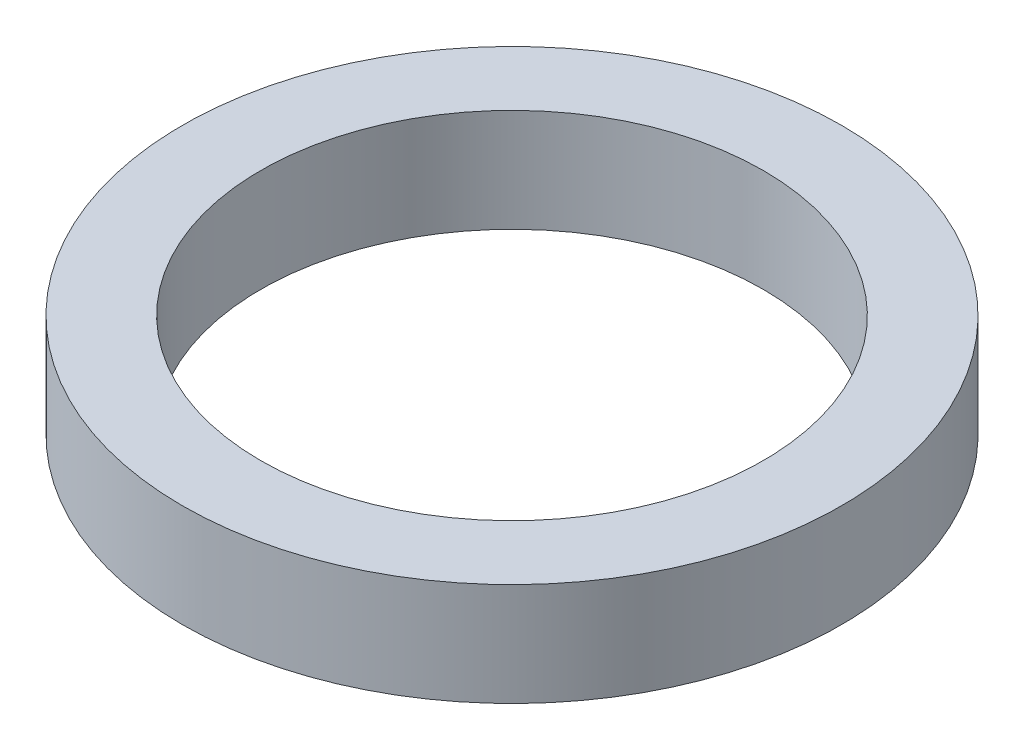
ISO-10303-21;
HEADER;
FILE_DESCRIPTION(('STEP AP214'),'2;1');
FILE_NAME('part.step','',(''),(''),'','','');
FILE_SCHEMA(('AUTOMOTIVE_DESIGN { 1 0 10303 214 1 1 1 1 }'));
ENDSEC;
DATA;
#1=APPLICATION_CONTEXT('core data for automotive mechanical design processes');
#2=APPLICATION_PROTOCOL_DEFINITION('international standard','automotive_design',2000,#1);
#3=PRODUCT_CONTEXT('',#1,'mechanical');
#4=PRODUCT('Part','Part','',(#3));
#5=PRODUCT_RELATED_PRODUCT_CATEGORY('part','',(#4));
#6=PRODUCT_DEFINITION_FORMATION('','',#4);
#7=PRODUCT_DEFINITION_CONTEXT('part definition',#1,'design');
#8=PRODUCT_DEFINITION('design','',#6,#7);
#9=PRODUCT_DEFINITION_SHAPE('','',#8);
#10=(LENGTH_UNIT() NAMED_UNIT(*) SI_UNIT(.MILLI.,.METRE.));
#11=(NAMED_UNIT(*) PLANE_ANGLE_UNIT() SI_UNIT($,.RADIAN.));
#12=(NAMED_UNIT(*) SI_UNIT($,.STERADIAN.) SOLID_ANGLE_UNIT());
#13=UNCERTAINTY_MEASURE_WITH_UNIT(LENGTH_MEASURE(1.E-05),#10,'distance_accuracy_value','');
#14=(GEOMETRIC_REPRESENTATION_CONTEXT(3) GLOBAL_UNCERTAINTY_ASSIGNED_CONTEXT((#13)) GLOBAL_UNIT_ASSIGNED_CONTEXT((#10,
#11,#12)) REPRESENTATION_CONTEXT('',''));
#15=CARTESIAN_POINT('',(0.,0.,0.));
#16=DIRECTION('',(0.,0.,1.));
#17=DIRECTION('',(1.,0.,0.));
#18=AXIS2_PLACEMENT_3D('',#15,#16,#17);
#19=CARTESIAN_POINT('',(8.0056,0.005599999999959,8.0056));
#20=DIRECTION('',(0.,1.,0.));
#21=DIRECTION('',(0.,0.,1.));
#22=AXIS2_PLACEMENT_3D('',#19,#20,#21);
#23=CYLINDRICAL_SURFACE('',#22,6.1);
#24=CARTESIAN_POINT('',(8.0056,0.005599999999959,8.0056));
#25=DIRECTION('',(0.,1.,0.));
#26=DIRECTION('',(0.,0.,1.));
#27=AXIS2_PLACEMENT_3D('',#24,#25,#26);
#28=CIRCLE('',#27,6.1);
#29=CARTESIAN_POINT('',(8.0056,0.005599999999959,14.1056));
#30=VERTEX_POINT('',#29);
#31=EDGE_CURVE('E26',#30,#30,#28,.F.);
#32=ORIENTED_EDGE('',*,*,#31,.T.);
#33=EDGE_LOOP('',(#32));
#34=FACE_BOUND('',#33,.T.);
#35=CARTESIAN_POINT('',(8.0056,2.5056,8.0056));
#36=DIRECTION('',(0.,1.,0.));
#37=DIRECTION('',(0.,0.,1.));
#38=AXIS2_PLACEMENT_3D('',#35,#36,#37);
#39=CIRCLE('',#38,6.1);
#40=CARTESIAN_POINT('',(8.0056,2.5056,14.1056));
#41=VERTEX_POINT('',#40);
#42=EDGE_CURVE('E17',#41,#41,#39,.F.);
#43=ORIENTED_EDGE('',*,*,#42,.F.);
#44=EDGE_LOOP('',(#43));
#45=FACE_BOUND('',#44,.T.);
#46=ADVANCED_FACE('F14',(#34,#45),#23,.F.);
#47=CARTESIAN_POINT('',(8.0056,2.5056,8.0056));
#48=DIRECTION('',(0.,1.,0.));
#49=DIRECTION('',(0.,0.,1.));
#50=AXIS2_PLACEMENT_3D('',#47,#48,#49);
#51=PLANE('',#50);
#52=ORIENTED_EDGE('',*,*,#42,.T.);
#53=EDGE_LOOP('',(#52));
#54=FACE_BOUND('',#53,.T.);
#55=CARTESIAN_POINT('',(8.0056,2.5056,8.0056));
#56=DIRECTION('',(0.,1.,0.));
#57=DIRECTION('',(0.,0.,1.));
#58=AXIS2_PLACEMENT_3D('',#55,#56,#57);
#59=CIRCLE('',#58,8.);
#60=CARTESIAN_POINT('',(8.0056,2.5056,16.0056));
#61=VERTEX_POINT('',#60);
#62=EDGE_CURVE('E21',#61,#61,#59,.F.);
#63=ORIENTED_EDGE('',*,*,#62,.F.);
#64=EDGE_LOOP('',(#63));
#65=FACE_BOUND('',#64,.T.);
#66=ADVANCED_FACE('F34',(#54,#65),#51,.T.);
#67=CARTESIAN_POINT('',(8.0056,0.005599999999959,8.0056));
#68=DIRECTION('',(0.,1.,0.));
#69=DIRECTION('',(0.,0.,1.));
#70=AXIS2_PLACEMENT_3D('',#67,#68,#69);
#71=PLANE('',#70);
#72=ORIENTED_EDGE('',*,*,#31,.F.);
#73=EDGE_LOOP('',(#72));
#74=FACE_BOUND('',#73,.T.);
#75=CARTESIAN_POINT('',(8.0056,0.005599999999959,8.0056));
#76=DIRECTION('',(0.,1.,0.));
#77=DIRECTION('',(0.,0.,1.));
#78=AXIS2_PLACEMENT_3D('',#75,#76,#77);
#79=CIRCLE('',#78,8.);
#80=CARTESIAN_POINT('',(8.0056,0.005599999999959,16.0056));
#81=VERTEX_POINT('',#80);
#82=EDGE_CURVE('E10',#81,#81,#79,.T.);
#83=ORIENTED_EDGE('',*,*,#82,.F.);
#84=EDGE_LOOP('',(#83));
#85=FACE_BOUND('',#84,.T.);
#86=ADVANCED_FACE('F42',(#74,#85),#71,.F.);
#87=CARTESIAN_POINT('',(8.0056,0.005599999999959,8.0056));
#88=DIRECTION('',(0.,1.,0.));
#89=DIRECTION('',(0.,0.,1.));
#90=AXIS2_PLACEMENT_3D('',#87,#88,#89);
#91=CYLINDRICAL_SURFACE('',#90,8.);
#92=ORIENTED_EDGE('',*,*,#82,.T.);
#93=EDGE_LOOP('',(#92));
#94=FACE_BOUND('',#93,.T.);
#95=ORIENTED_EDGE('',*,*,#62,.T.);
#96=EDGE_LOOP('',(#95));
#97=FACE_BOUND('',#96,.T.);
#98=ADVANCED_FACE('F43',(#94,#97),#91,.T.);
#99=CLOSED_SHELL('',(#46,#66,#86,#98));
#100=MANIFOLD_SOLID_BREP('B1',#99);
#101=ADVANCED_BREP_SHAPE_REPRESENTATION('',(#18,#100),#14);
#102=SHAPE_DEFINITION_REPRESENTATION(#9,#101);
ENDSEC;
END-ISO-10303-21;
